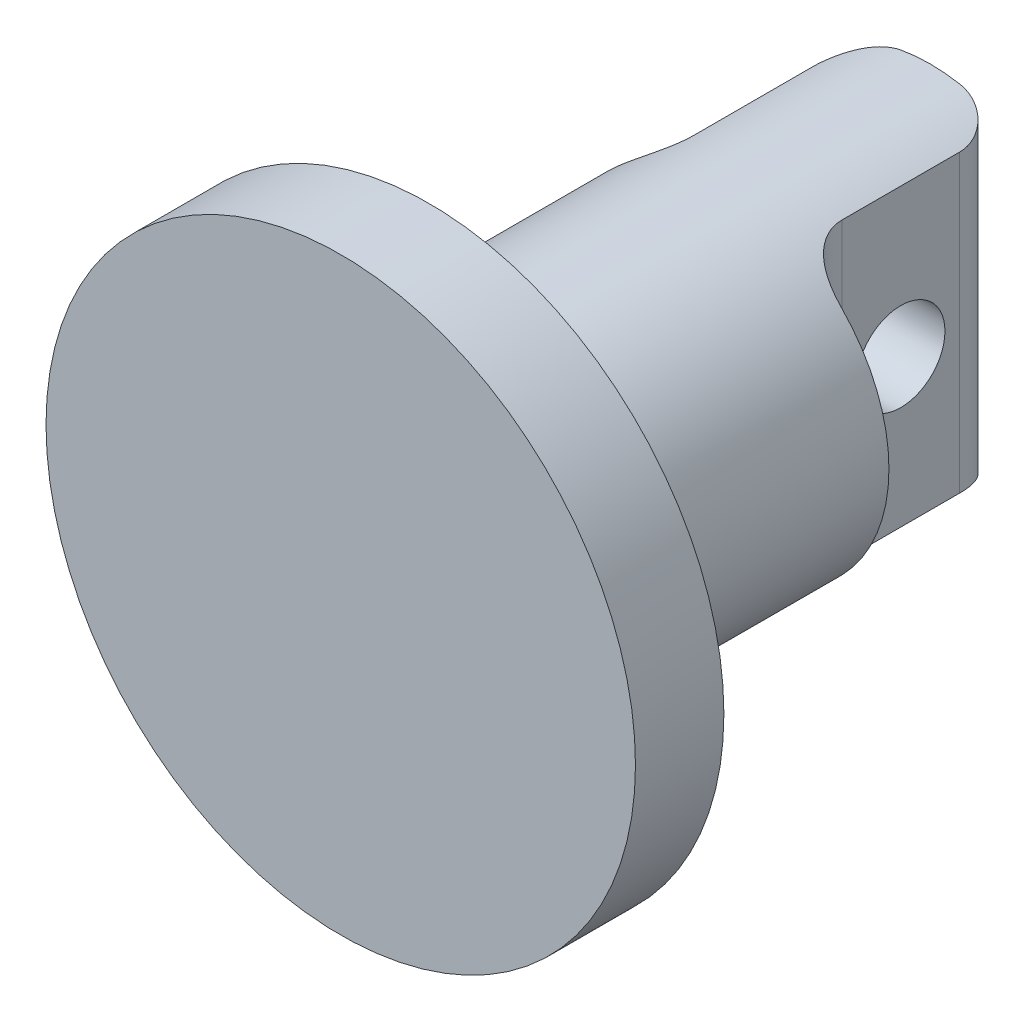
ISO-10303-21;
HEADER;
FILE_DESCRIPTION(('STEP AP214'),'2;1');
FILE_NAME('part.step','',(''),(''),'','','');
FILE_SCHEMA(('AUTOMOTIVE_DESIGN { 1 0 10303 214 1 1 1 1 }'));
ENDSEC;
DATA;
#1=APPLICATION_CONTEXT('core data for automotive mechanical design processes');
#2=APPLICATION_PROTOCOL_DEFINITION('international standard','automotive_design',2000,#1);
#3=PRODUCT_CONTEXT('',#1,'mechanical');
#4=PRODUCT('Part','Part','',(#3));
#5=PRODUCT_RELATED_PRODUCT_CATEGORY('part','',(#4));
#6=PRODUCT_DEFINITION_FORMATION('','',#4);
#7=PRODUCT_DEFINITION_CONTEXT('part definition',#1,'design');
#8=PRODUCT_DEFINITION('design','',#6,#7);
#9=PRODUCT_DEFINITION_SHAPE('','',#8);
#10=(LENGTH_UNIT() NAMED_UNIT(*) SI_UNIT(.MILLI.,.METRE.));
#11=(NAMED_UNIT(*) PLANE_ANGLE_UNIT() SI_UNIT($,.RADIAN.));
#12=(NAMED_UNIT(*) SI_UNIT($,.STERADIAN.) SOLID_ANGLE_UNIT());
#13=UNCERTAINTY_MEASURE_WITH_UNIT(LENGTH_MEASURE(1.E-05),#10,'distance_accuracy_value','');
#14=(GEOMETRIC_REPRESENTATION_CONTEXT(3) GLOBAL_UNCERTAINTY_ASSIGNED_CONTEXT((#13)) GLOBAL_UNIT_ASSIGNED_CONTEXT((#10,
#11,#12)) REPRESENTATION_CONTEXT('',''));
#15=CARTESIAN_POINT('',(0.,0.,0.));
#16=DIRECTION('',(0.,0.,1.));
#17=DIRECTION('',(1.,0.,0.));
#18=AXIS2_PLACEMENT_3D('',#15,#16,#17);
#19=CARTESIAN_POINT('',(0.,0.,0.));
#20=DIRECTION('',(0.,0.,1.));
#21=DIRECTION('',(1.,0.,0.));
#22=AXIS2_PLACEMENT_3D('',#19,#20,#21);
#23=PLANE('',#22);
#24=CARTESIAN_POINT('',(0.,0.,0.));
#25=DIRECTION('',(0.,0.,1.));
#26=DIRECTION('',(1.,0.,0.));
#27=AXIS2_PLACEMENT_3D('',#24,#25,#26);
#28=CIRCLE('',#27,8.6);
#29=CARTESIAN_POINT('',(8.6,0.,0.));
#30=VERTEX_POINT('',#29);
#31=EDGE_CURVE('E110',#30,#30,#28,.T.);
#32=ORIENTED_EDGE('',*,*,#31,.T.);
#33=EDGE_LOOP('',(#32));
#34=FACE_BOUND('',#33,.T.);
#35=CARTESIAN_POINT('',(0.,0.,0.));
#36=DIRECTION('',(0.,0.,1.));
#37=DIRECTION('',(1.,0.,0.));
#38=AXIS2_PLACEMENT_3D('',#35,#36,#37);
#39=CIRCLE('',#38,10.);
#40=CARTESIAN_POINT('',(10.,0.,0.));
#41=VERTEX_POINT('',#40);
#42=EDGE_CURVE('E242',#41,#41,#39,.T.);
#43=ORIENTED_EDGE('',*,*,#42,.F.);
#44=EDGE_LOOP('',(#43));
#45=FACE_BOUND('',#44,.T.);
#46=ADVANCED_FACE('F36',(#34,#45),#23,.F.);
#47=CARTESIAN_POINT('',(0.,0.,3.));
#48=DIRECTION('',(0.,0.,-1.));
#49=DIRECTION('',(-1.,0.,0.));
#50=AXIS2_PLACEMENT_3D('',#47,#48,#49);
#51=CYLINDRICAL_SURFACE('',#50,10.);
#52=CARTESIAN_POINT('',(0.,0.,3.));
#53=DIRECTION('',(0.,0.,1.));
#54=DIRECTION('',(1.,0.,0.));
#55=AXIS2_PLACEMENT_3D('',#52,#53,#54);
#56=CIRCLE('',#55,10.);
#57=CARTESIAN_POINT('',(10.,0.,3.));
#58=VERTEX_POINT('',#57);
#59=EDGE_CURVE('E363',#58,#58,#56,.T.);
#60=ORIENTED_EDGE('',*,*,#59,.F.);
#61=EDGE_LOOP('',(#60));
#62=FACE_BOUND('',#61,.T.);
#63=ORIENTED_EDGE('',*,*,#42,.T.);
#64=EDGE_LOOP('',(#63));
#65=FACE_BOUND('',#64,.T.);
#66=ADVANCED_FACE('F206',(#62,#65),#51,.T.);
#67=CARTESIAN_POINT('',(0.,0.,3.));
#68=DIRECTION('',(0.,0.,1.));
#69=DIRECTION('',(1.,0.,0.));
#70=AXIS2_PLACEMENT_3D('',#67,#68,#69);
#71=PLANE('',#70);
#72=ORIENTED_EDGE('',*,*,#59,.T.);
#73=EDGE_LOOP('',(#72));
#74=FACE_BOUND('',#73,.T.);
#75=ADVANCED_FACE('F155',(#74),#71,.T.);
#76=CARTESIAN_POINT('',(0.,0.,-17.));
#77=DIRECTION('',(0.,0.,1.));
#78=DIRECTION('',(1.,0.,0.));
#79=AXIS2_PLACEMENT_3D('',#76,#77,#78);
#80=CYLINDRICAL_SURFACE('',#79,5.6);
#81=CARTESIAN_POINT('',(0.,0.,-3.));
#82=DIRECTION('',(0.,0.,1.));
#83=DIRECTION('',(1.,0.,0.));
#84=AXIS2_PLACEMENT_3D('',#81,#82,#83);
#85=CIRCLE('',#84,5.6);
#86=CARTESIAN_POINT('',(5.6,0.,-3.));
#87=VERTEX_POINT('',#86);
#88=EDGE_CURVE('E125',#87,#87,#85,.F.);
#89=ORIENTED_EDGE('',*,*,#88,.T.);
#90=EDGE_LOOP('',(#89));
#91=FACE_BOUND('',#90,.T.);
#92=DIRECTION('',(0.,0.,1.));
#93=VECTOR('',#92,1.);
#94=CARTESIAN_POINT('',(-2.5,-5.01098792654702,-17.));
#95=LINE('',#94,#93);
#96=CARTESIAN_POINT('',(-2.5,-5.01098792654702,-11.5));
#97=VERTEX_POINT('',#96);
#98=CARTESIAN_POINT('',(-2.5,-5.01098792654702,-15.5));
#99=VERTEX_POINT('',#98);
#100=EDGE_CURVE('E108',#97,#99,#95,.F.);
#101=ORIENTED_EDGE('',*,*,#100,.T.);
#102=CARTESIAN_POINT('',(-2.5,-5.01098792654702,-15.5));
#103=CARTESIAN_POINT('',(-2.5000020804932,-5.01098386540568,-15.5395725011254));
#104=CARTESIAN_POINT('',(-2.49843294481036,-5.01177002350182,-15.5791239922962));
#105=CARTESIAN_POINT('',(-2.49218861536451,-5.01487928972236,-15.6579048751711));
#106=CARTESIAN_POINT('',(-2.48751464530948,-5.017201792326,-15.6971343876123));
#107=CARTESIAN_POINT('',(-2.46895310911888,-5.02637746679336,-15.8135594581204));
#108=CARTESIAN_POINT('',(-2.45052502289085,-5.03543974754558,-15.88991104718));
#109=CARTESIAN_POINT('',(-2.40237161237888,-5.05858790620674,-16.0379794446277));
#110=CARTESIAN_POINT('',(-2.37265886624782,-5.07266818985616,-16.1097013096591));
#111=CARTESIAN_POINT('',(-2.30298371585328,-5.10467755632712,-16.2471099442359));
#112=CARTESIAN_POINT('',(-2.2630111953227,-5.12261043499499,-16.312790669817));
#113=CARTESIAN_POINT('',(-2.17141281857218,-5.16213023737658,-16.4403776451357));
#114=CARTESIAN_POINT('',(-2.11924950501061,-5.18386787648468,-16.5018504279728));
#115=CARTESIAN_POINT('',(-2.00607340449965,-5.22870677700186,-16.615459784027));
#116=CARTESIAN_POINT('',(-1.94505678929908,-5.25180862573225,-16.667592296518));
#117=CARTESIAN_POINT('',(-1.81019268688118,-5.29987993214784,-16.7653363169122));
#118=CARTESIAN_POINT('',(-1.73570424955865,-5.32484780646086,-16.8100673581615));
#119=CARTESIAN_POINT('',(-1.57974465073416,-5.37317998442629,-16.886151142896));
#120=CARTESIAN_POINT('',(-1.49827861035609,-5.39654544185285,-16.9175135987391));
#121=CARTESIAN_POINT('',(-1.34760565609259,-5.43587189487601,-16.960819199001));
#122=CARTESIAN_POINT('',(-1.27929438996599,-5.45237039149003,-16.9754206613721));
#123=CARTESIAN_POINT('',(-1.14076362477681,-5.48304543588229,-16.9950256519124));
#124=CARTESIAN_POINT('',(-1.07054304586715,-5.49722063643315,-17.0000236291209));
#125=CARTESIAN_POINT('',(-1.,-5.50999092558236,-17.));
#126=B_SPLINE_CURVE_WITH_KNOTS('',3,(#102,#103,#104,#105,#106,#107,#108,#109,#110,#111,#112,
#113,#114,#115,#116,#117,#118,#119,#120,#121,#122,#123,#124,#125),.UNSPECIFIED.,.F.,.F.,(4,2,2,
2,2,2,2,2,2,2,2,4),(0.,0.118637964226897,0.237229197409223,0.473170501747677,0.708849588412844,
0.944761956370707,1.19422423603551,1.44379470880183,1.71375047222331,1.98350977549838,
2.19815830777773,2.41293087289718),.UNSPECIFIED.);
#127=CARTESIAN_POINT('',(-1.,-5.50999092558236,-17.));
#128=VERTEX_POINT('',#127);
#129=EDGE_CURVE('E171',#99,#128,#126,.T.);
#130=ORIENTED_EDGE('',*,*,#129,.T.);
#131=CARTESIAN_POINT('',(0.,0.,-17.));
#132=DIRECTION('',(0.,0.,-1.));
#133=DIRECTION('',(-1.,0.,0.));
#134=AXIS2_PLACEMENT_3D('',#131,#132,#133);
#135=CIRCLE('',#134,5.6);
#136=CARTESIAN_POINT('',(1.,-5.50999092558236,-17.));
#137=VERTEX_POINT('',#136);
#138=EDGE_CURVE('E243',#137,#128,#135,.T.);
#139=ORIENTED_EDGE('',*,*,#138,.F.);
#140=CARTESIAN_POINT('',(1.,-5.50999092558236,-17.));
#141=CARTESIAN_POINT('',(1.0431357750744,-5.50216525904986,-17.0000002889022));
#142=CARTESIAN_POINT('',(1.08615359317973,-5.49383123010131,-16.9981384460265));
#143=CARTESIAN_POINT('',(1.17166685141476,-5.47623015731936,-16.9907624586411));
#144=CARTESIAN_POINT('',(1.21416247296195,-5.46696344841963,-16.9852496212957));
#145=CARTESIAN_POINT('',(1.3401887639641,-5.43794852352108,-16.9633914739219));
#146=CARTESIAN_POINT('',(1.42256390588289,-5.41692970323941,-16.9417254477834));
#147=CARTESIAN_POINT('',(1.58180278663491,-5.37259209995911,-16.8851540203785));
#148=CARTESIAN_POINT('',(1.65867169675423,-5.34927552517556,-16.8502612403694));
#149=CARTESIAN_POINT('',(1.80531751706315,-5.30158259710547,-16.7682756767982));
#150=CARTESIAN_POINT('',(1.87508918255689,-5.2772054788231,-16.7211739610188));
#151=CARTESIAN_POINT('',(2.0083556690194,-5.22797720762672,-16.6139160966464));
#152=CARTESIAN_POINT('',(2.07151596208769,-5.20314268003664,-16.5533357924905));
#153=CARTESIAN_POINT('',(2.18673797636213,-5.15577972730389,-16.4215791801319));
#154=CARTESIAN_POINT('',(2.23879824157279,-5.1332516048946,-16.3504014839417));
#155=CARTESIAN_POINT('',(2.32948785162619,-5.0927330594954,-16.2000525597936));
#156=CARTESIAN_POINT('',(2.36827835891485,-5.07468897321799,-16.1209935103895));
#157=CARTESIAN_POINT('',(2.43160009913251,-5.04465718708589,-15.9563554350108));
#158=CARTESIAN_POINT('',(2.45616029662659,-5.03265719156463,-15.8707900567923));
#159=CARTESIAN_POINT('',(2.48193557874058,-5.01996911315989,-15.7369083960247));
#160=CARTESIAN_POINT('',(2.48869640698838,-5.01661546402954,-15.6898457537173));
#161=CARTESIAN_POINT('',(2.49773104489937,-5.01212031245242,-15.5951999860403));
#162=CARTESIAN_POINT('',(2.50000596090449,-5.01097826456884,-15.5476169919148));
#163=CARTESIAN_POINT('',(2.5,-5.01098792654702,-15.5));
#164=B_SPLINE_CURVE_WITH_KNOTS('',3,(#140,#141,#142,#143,#144,#145,#146,#147,#148,#149,#150,
#151,#152,#153,#154,#155,#156,#157,#158,#159,#160,#161,#162,#163),.UNSPECIFIED.,.F.,.F.,(4,2,2,
2,2,2,2,2,2,2,2,4),(0.,0.131429504807568,0.262811979376038,0.52465896302352,0.786256712976935,
1.04804639414124,1.31967659915426,1.59134241212977,1.85958079849224,2.12727127325902,
2.27002499369472,2.4127435029665),.UNSPECIFIED.);
#165=CARTESIAN_POINT('',(2.5,-5.01098792654702,-15.5));
#166=VERTEX_POINT('',#165);
#167=EDGE_CURVE('E133',#137,#166,#164,.T.);
#168=ORIENTED_EDGE('',*,*,#167,.T.);
#169=DIRECTION('',(0.,0.,1.));
#170=VECTOR('',#169,1.);
#171=CARTESIAN_POINT('',(2.5,-5.01098792654702,-17.));
#172=LINE('',#171,#170);
#173=CARTESIAN_POINT('',(2.5,-5.01098792654702,-11.5));
#174=VERTEX_POINT('',#173);
#175=EDGE_CURVE('E120',#166,#174,#172,.T.);
#176=ORIENTED_EDGE('',*,*,#175,.T.);
#177=CARTESIAN_POINT('',(2.5,-5.01098792654702,-11.5));
#178=CARTESIAN_POINT('',(2.49999844532188,-5.01098605975963,-11.4616087248729));
#179=CARTESIAN_POINT('',(2.50147503292777,-5.01025231108213,-11.4232363931987));
#180=CARTESIAN_POINT('',(2.50735348108305,-5.00731410603619,-11.3467785175572));
#181=CARTESIAN_POINT('',(2.51175493108791,-5.00510985607259,-11.3086929340996));
#182=CARTESIAN_POINT('',(2.52926194656355,-4.99630013425496,-11.1954739584162));
#183=CARTESIAN_POINT('',(2.54667063879383,-4.98749773902104,-11.1211207884798));
#184=CARTESIAN_POINT('',(2.59216946245848,-4.96400076184108,-10.9767905047417));
#185=CARTESIAN_POINT('',(2.62026021251362,-4.94930583864348,-10.9068136446547));
#186=CARTESIAN_POINT('',(2.68583584980902,-4.91402750126924,-10.7730039536221));
#187=CARTESIAN_POINT('',(2.72332327114746,-4.89344249844124,-10.709172786487));
#188=CARTESIAN_POINT('',(2.80690028343339,-4.8459942461289,-10.5878278514886));
#189=CARTESIAN_POINT('',(2.85315683574015,-4.81900603636376,-10.5304785632747));
#190=CARTESIAN_POINT('',(2.95167990030185,-4.75929602991547,-10.4247089164592));
#191=CARTESIAN_POINT('',(3.00394464051544,-4.72657592230139,-10.3762859360669));
#192=CARTESIAN_POINT('',(3.11692455378363,-4.65292232365463,-10.2851460559756));
#193=CARTESIAN_POINT('',(3.1779812305425,-4.61153525982092,-10.2432230603618));
#194=CARTESIAN_POINT('',(3.30259788637749,-4.52312917531629,-10.1700105708581));
#195=CARTESIAN_POINT('',(3.36616437104541,-4.47609477201399,-10.1387510539356));
#196=CARTESIAN_POINT('',(3.47863230154504,-4.38895526792786,-10.0925366978604));
#197=CARTESIAN_POINT('',(3.52745519326802,-4.34983358810063,-10.0754750754575));
#198=CARTESIAN_POINT('',(3.624733043728,-4.26911086138937,-10.0468148597547));
#199=CARTESIAN_POINT('',(3.67318758591487,-4.22750737532109,-10.0352217441161));
#200=CARTESIAN_POINT('',(3.76886997937975,-4.14242568117838,-10.0171181181185));
#201=CARTESIAN_POINT('',(3.8161032057753,-4.09895936269225,-10.0105793259212));
#202=CARTESIAN_POINT('',(3.90916509774067,-4.01030876341671,-10.0020267392921));
#203=CARTESIAN_POINT('',(3.95499655700509,-3.96512836484636,-10.0000032754364));
#204=CARTESIAN_POINT('',(4.,-3.91918358845308,-10.));
#205=B_SPLINE_CURVE_WITH_KNOTS('',3,(#177,#178,#179,#180,#181,#182,#183,#184,#185,#186,#187,
#188,#189,#190,#191,#192,#193,#194,#195,#196,#197,#198,#199,#200,#201,#202,#203,#204),
.UNSPECIFIED.,.F.,.F.,(4,2,2,2,2,2,2,2,2,2,2,2,2,4),(0.,0.115101046934982,0.230185941272075,
0.459593197899069,0.689013742013861,0.918496223045589,1.15289102850619,1.38721687860825,
1.64076447615015,1.89501907870281,2.089284445406,2.28374399162558,2.47710738617681,
2.6700563005188),.UNSPECIFIED.);
#206=CARTESIAN_POINT('',(4.,-3.91918358845308,-10.));
#207=VERTEX_POINT('',#206);
#208=EDGE_CURVE('E12',#174,#207,#205,.T.);
#209=ORIENTED_EDGE('',*,*,#208,.T.);
#210=CARTESIAN_POINT('',(0.,0.,-10.));
#211=DIRECTION('',(0.,0.,-1.));
#212=DIRECTION('',(-1.,0.,0.));
#213=AXIS2_PLACEMENT_3D('',#210,#211,#212);
#214=CIRCLE('',#213,5.6);
#215=CARTESIAN_POINT('',(4.,3.91918358845308,-10.));
#216=VERTEX_POINT('',#215);
#217=EDGE_CURVE('E123',#216,#207,#214,.T.);
#218=ORIENTED_EDGE('',*,*,#217,.F.);
#219=CARTESIAN_POINT('',(4.,3.91918358845308,-10.));
#220=CARTESIAN_POINT('',(3.9557336803865,3.96437492473145,-10.0000033469822));
#221=CARTESIAN_POINT('',(3.91066820298925,4.00882603571216,-10.001960904263));
#222=CARTESIAN_POINT('',(3.81918676707573,4.09607014262874,-10.0102269052185));
#223=CARTESIAN_POINT('',(3.77276836887405,4.1388597710828,-10.0165437429517));
#224=CARTESIAN_POINT('',(3.67865738367702,4.22273424589004,-10.0340382842501));
#225=CARTESIAN_POINT('',(3.63095793272987,4.26380422561554,-10.0452514247408));
#226=CARTESIAN_POINT('',(3.53517126489213,4.34355264612186,-10.0729679651696));
#227=CARTESIAN_POINT('',(3.48708440180229,4.38223303908223,-10.0894669767605));
#228=CARTESIAN_POINT('',(3.36770023341093,4.47512441155301,-10.1376084788785));
#229=CARTESIAN_POINT('',(3.29649458651223,4.52773396683386,-10.1727131624566));
#230=CARTESIAN_POINT('',(3.15741936012218,4.62578965948223,-10.2563691011738));
#231=CARTESIAN_POINT('',(3.08954041268094,4.67125681502645,-10.3048796978459));
#232=CARTESIAN_POINT('',(2.95967539347949,4.75461124064817,-10.4159885788762));
#233=CARTESIAN_POINT('',(2.89774353973631,4.7924317165616,-10.4787016416199));
#234=CARTESIAN_POINT('',(2.7841641032247,4.85930002163556,-10.6169749042305));
#235=CARTESIAN_POINT('',(2.73251858454951,4.88834609069483,-10.6925376769387));
#236=CARTESIAN_POINT('',(2.64857801238486,4.9342724729647,-10.844085980049));
#237=CARTESIAN_POINT('',(2.6146816186877,4.95221168523887,-10.918868913277));
#238=CARTESIAN_POINT('',(2.55937136974278,4.98102422435756,-11.074143720394));
#239=CARTESIAN_POINT('',(2.5379390462439,4.99190800812404,-11.1546269485125));
#240=CARTESIAN_POINT('',(2.51557298798128,5.00319512688941,-11.2799333289134));
#241=CARTESIAN_POINT('',(2.5097391768057,5.00612014491925,-11.3237216604271));
#242=CARTESIAN_POINT('',(2.50195365053542,5.01001359195367,-11.4116649506208));
#243=CARTESIAN_POINT('',(2.49999639781366,5.01098481197141,-11.4558192957153));
#244=CARTESIAN_POINT('',(2.5,5.01098792654702,-11.5));
#245=B_SPLINE_CURVE_WITH_KNOTS('',3,(#219,#220,#221,#222,#223,#224,#225,#226,#227,#228,#229,
#230,#231,#232,#233,#234,#235,#236,#237,#238,#239,#240,#241,#242,#243,#244),.UNSPECIFIED.,.F.,
.F.,(4,2,2,2,2,2,2,2,2,2,2,2,4),(0.,0.189784007279751,0.379934478566911,0.571484582290015,
0.762876070802288,1.04739762955487,1.33106556508882,1.61711342007846,1.90321861676455,
2.15402154935302,2.40445190932844,2.53707794764393,2.66951439388349),.UNSPECIFIED.);
#246=CARTESIAN_POINT('',(2.5,5.01098792654702,-11.5));
#247=VERTEX_POINT('',#246);
#248=EDGE_CURVE('E49',#216,#247,#245,.T.);
#249=ORIENTED_EDGE('',*,*,#248,.T.);
#250=DIRECTION('',(0.,0.,1.));
#251=VECTOR('',#250,1.);
#252=CARTESIAN_POINT('',(2.5,5.01098792654702,-17.));
#253=LINE('',#252,#251);
#254=CARTESIAN_POINT('',(2.5,5.01098792654702,-15.5));
#255=VERTEX_POINT('',#254);
#256=EDGE_CURVE('E235',#247,#255,#253,.F.);
#257=ORIENTED_EDGE('',*,*,#256,.T.);
#258=CARTESIAN_POINT('',(2.5,5.01098792654702,-15.5));
#259=CARTESIAN_POINT('',(2.5000020804932,5.01098386540568,-15.5395725011254));
#260=CARTESIAN_POINT('',(2.49843294481036,5.01177002350182,-15.5791239922962));
#261=CARTESIAN_POINT('',(2.49218861536451,5.01487928972236,-15.6579048751711));
#262=CARTESIAN_POINT('',(2.48751464530948,5.017201792326,-15.6971343876123));
#263=CARTESIAN_POINT('',(2.46895310911888,5.02637746679336,-15.8135594581204));
#264=CARTESIAN_POINT('',(2.45052502289085,5.03543974754558,-15.88991104718));
#265=CARTESIAN_POINT('',(2.40237161237888,5.05858790620674,-16.0379794446277));
#266=CARTESIAN_POINT('',(2.37265886624782,5.07266818985616,-16.1097013096591));
#267=CARTESIAN_POINT('',(2.30298371585328,5.10467755632712,-16.2471099442359));
#268=CARTESIAN_POINT('',(2.2630111953227,5.12261043499499,-16.312790669817));
#269=CARTESIAN_POINT('',(2.17141281857218,5.16213023737658,-16.4403776451357));
#270=CARTESIAN_POINT('',(2.11924950501061,5.18386787648468,-16.5018504279728));
#271=CARTESIAN_POINT('',(2.00607340449965,5.22870677700186,-16.615459784027));
#272=CARTESIAN_POINT('',(1.94505678929908,5.25180862573225,-16.667592296518));
#273=CARTESIAN_POINT('',(1.81019268688118,5.29987993214784,-16.7653363169122));
#274=CARTESIAN_POINT('',(1.73570424955865,5.32484780646086,-16.8100673581615));
#275=CARTESIAN_POINT('',(1.57974465073416,5.37317998442629,-16.886151142896));
#276=CARTESIAN_POINT('',(1.49827861035609,5.39654544185285,-16.9175135987391));
#277=CARTESIAN_POINT('',(1.34760565609259,5.43587189487601,-16.960819199001));
#278=CARTESIAN_POINT('',(1.27929438996599,5.45237039149003,-16.9754206613721));
#279=CARTESIAN_POINT('',(1.14076362477681,5.48304543588229,-16.9950256519124));
#280=CARTESIAN_POINT('',(1.07054304586715,5.49722063643315,-17.0000236291209));
#281=CARTESIAN_POINT('',(1.,5.50999092558236,-17.));
#282=B_SPLINE_CURVE_WITH_KNOTS('',3,(#258,#259,#260,#261,#262,#263,#264,#265,#266,#267,#268,
#269,#270,#271,#272,#273,#274,#275,#276,#277,#278,#279,#280,#281),.UNSPECIFIED.,.F.,.F.,(4,2,2,
2,2,2,2,2,2,2,2,4),(0.,0.118637964226897,0.237229197409223,0.473170501747677,0.708849588412844,
0.944761956370707,1.19422423603551,1.44379470880183,1.71375047222331,1.98350977549838,
2.19815830777773,2.41293087289718),.UNSPECIFIED.);
#283=CARTESIAN_POINT('',(1.,5.50999092558236,-17.));
#284=VERTEX_POINT('',#283);
#285=EDGE_CURVE('E140',#255,#284,#282,.T.);
#286=ORIENTED_EDGE('',*,*,#285,.T.);
#287=CARTESIAN_POINT('',(-1.,5.50999092558236,-17.));
#288=VERTEX_POINT('',#287);
#289=EDGE_CURVE('E233',#288,#284,#135,.T.);
#290=ORIENTED_EDGE('',*,*,#289,.F.);
#291=CARTESIAN_POINT('',(-1.,5.50999092558236,-17.));
#292=CARTESIAN_POINT('',(-1.0431357750744,5.50216525904986,-17.0000002889022));
#293=CARTESIAN_POINT('',(-1.08615359317973,5.49383123010131,-16.9981384460265));
#294=CARTESIAN_POINT('',(-1.17166685141476,5.47623015731936,-16.9907624586411));
#295=CARTESIAN_POINT('',(-1.21416247296195,5.46696344841963,-16.9852496212957));
#296=CARTESIAN_POINT('',(-1.3401887639641,5.43794852352108,-16.9633914739219));
#297=CARTESIAN_POINT('',(-1.42256390588289,5.41692970323941,-16.9417254477834));
#298=CARTESIAN_POINT('',(-1.58180278663491,5.37259209995911,-16.8851540203785));
#299=CARTESIAN_POINT('',(-1.65867169675423,5.34927552517556,-16.8502612403694));
#300=CARTESIAN_POINT('',(-1.80531751706315,5.30158259710547,-16.7682756767982));
#301=CARTESIAN_POINT('',(-1.87508918255689,5.2772054788231,-16.7211739610188));
#302=CARTESIAN_POINT('',(-2.0083556690194,5.22797720762672,-16.6139160966464));
#303=CARTESIAN_POINT('',(-2.07151596208769,5.20314268003664,-16.5533357924905));
#304=CARTESIAN_POINT('',(-2.18673797636213,5.15577972730389,-16.4215791801319));
#305=CARTESIAN_POINT('',(-2.23879824157279,5.1332516048946,-16.3504014839417));
#306=CARTESIAN_POINT('',(-2.32948785162619,5.0927330594954,-16.2000525597936));
#307=CARTESIAN_POINT('',(-2.36827835891485,5.07468897321799,-16.1209935103895));
#308=CARTESIAN_POINT('',(-2.43160009913251,5.04465718708589,-15.9563554350108));
#309=CARTESIAN_POINT('',(-2.45616029662659,5.03265719156463,-15.8707900567923));
#310=CARTESIAN_POINT('',(-2.48193557874058,5.01996911315989,-15.7369083960247));
#311=CARTESIAN_POINT('',(-2.48869640698838,5.01661546402954,-15.6898457537173));
#312=CARTESIAN_POINT('',(-2.49773104489937,5.01212031245242,-15.5951999860403));
#313=CARTESIAN_POINT('',(-2.50000596090449,5.01097826456884,-15.5476169919148));
#314=CARTESIAN_POINT('',(-2.5,5.01098792654702,-15.5));
#315=B_SPLINE_CURVE_WITH_KNOTS('',3,(#291,#292,#293,#294,#295,#296,#297,#298,#299,#300,#301,
#302,#303,#304,#305,#306,#307,#308,#309,#310,#311,#312,#313,#314),.UNSPECIFIED.,.F.,.F.,(4,2,2,
2,2,2,2,2,2,2,2,4),(0.,0.131429504807568,0.262811979376038,0.52465896302352,0.786256712976935,
1.04804639414124,1.31967659915426,1.59134241212977,1.85958079849224,2.12727127325902,
2.27002499369472,2.4127435029665),.UNSPECIFIED.);
#316=CARTESIAN_POINT('',(-2.5,5.01098792654702,-15.5));
#317=VERTEX_POINT('',#316);
#318=EDGE_CURVE('E164',#288,#317,#315,.T.);
#319=ORIENTED_EDGE('',*,*,#318,.T.);
#320=DIRECTION('',(0.,0.,1.));
#321=VECTOR('',#320,1.);
#322=CARTESIAN_POINT('',(-2.5,5.01098792654702,-17.));
#323=LINE('',#322,#321);
#324=CARTESIAN_POINT('',(-2.5,5.01098792654702,-11.5));
#325=VERTEX_POINT('',#324);
#326=EDGE_CURVE('E119',#317,#325,#323,.T.);
#327=ORIENTED_EDGE('',*,*,#326,.T.);
#328=CARTESIAN_POINT('',(-2.5,5.01098792654702,-11.5));
#329=CARTESIAN_POINT('',(-2.49999844532188,5.01098605975963,-11.4616087248729));
#330=CARTESIAN_POINT('',(-2.50147503292777,5.01025231108213,-11.4232363931987));
#331=CARTESIAN_POINT('',(-2.50735348108305,5.00731410603619,-11.3467785175572));
#332=CARTESIAN_POINT('',(-2.51175493108791,5.00510985607259,-11.3086929340996));
#333=CARTESIAN_POINT('',(-2.52926194656355,4.99630013425496,-11.1954739584162));
#334=CARTESIAN_POINT('',(-2.54667063879383,4.98749773902104,-11.1211207884798));
#335=CARTESIAN_POINT('',(-2.59216946245848,4.96400076184108,-10.9767905047417));
#336=CARTESIAN_POINT('',(-2.62026021251362,4.94930583864348,-10.9068136446547));
#337=CARTESIAN_POINT('',(-2.68583584980902,4.91402750126924,-10.7730039536221));
#338=CARTESIAN_POINT('',(-2.72332327114746,4.89344249844124,-10.709172786487));
#339=CARTESIAN_POINT('',(-2.80690028343339,4.8459942461289,-10.5878278514886));
#340=CARTESIAN_POINT('',(-2.85315683574015,4.81900603636376,-10.5304785632747));
#341=CARTESIAN_POINT('',(-2.95167990030185,4.75929602991547,-10.4247089164592));
#342=CARTESIAN_POINT('',(-3.00394464051544,4.72657592230139,-10.3762859360669));
#343=CARTESIAN_POINT('',(-3.11692455378363,4.65292232365463,-10.2851460559756));
#344=CARTESIAN_POINT('',(-3.1779812305425,4.61153525982092,-10.2432230603618));
#345=CARTESIAN_POINT('',(-3.30259788637749,4.52312917531629,-10.1700105708581));
#346=CARTESIAN_POINT('',(-3.36616437104541,4.47609477201399,-10.1387510539356));
#347=CARTESIAN_POINT('',(-3.47863230154504,4.38895526792786,-10.0925366978604));
#348=CARTESIAN_POINT('',(-3.52745519326802,4.34983358810063,-10.0754750754575));
#349=CARTESIAN_POINT('',(-3.624733043728,4.26911086138937,-10.0468148597547));
#350=CARTESIAN_POINT('',(-3.67318758591487,4.22750737532109,-10.0352217441161));
#351=CARTESIAN_POINT('',(-3.76886997937975,4.14242568117838,-10.0171181181185));
#352=CARTESIAN_POINT('',(-3.8161032057753,4.09895936269225,-10.0105793259212));
#353=CARTESIAN_POINT('',(-3.90916509774067,4.01030876341671,-10.0020267392921));
#354=CARTESIAN_POINT('',(-3.95499655700509,3.96512836484636,-10.0000032754364));
#355=CARTESIAN_POINT('',(-4.,3.91918358845308,-10.));
#356=B_SPLINE_CURVE_WITH_KNOTS('',3,(#328,#329,#330,#331,#332,#333,#334,#335,#336,#337,#338,
#339,#340,#341,#342,#343,#344,#345,#346,#347,#348,#349,#350,#351,#352,#353,#354,#355),
.UNSPECIFIED.,.F.,.F.,(4,2,2,2,2,2,2,2,2,2,2,2,2,4),(0.,0.115101046934982,0.230185941272075,
0.459593197899069,0.689013742013861,0.918496223045589,1.15289102850619,1.38721687860825,
1.64076447615015,1.89501907870281,2.089284445406,2.28374399162558,2.47710738617681,
2.6700563005188),.UNSPECIFIED.);
#357=CARTESIAN_POINT('',(-4.,3.91918358845308,-10.));
#358=VERTEX_POINT('',#357);
#359=EDGE_CURVE('E64',#325,#358,#356,.T.);
#360=ORIENTED_EDGE('',*,*,#359,.T.);
#361=CARTESIAN_POINT('',(0.,0.,-10.));
#362=DIRECTION('',(0.,0.,1.));
#363=DIRECTION('',(1.,0.,0.));
#364=AXIS2_PLACEMENT_3D('',#361,#362,#363);
#365=CIRCLE('',#364,5.6);
#366=CARTESIAN_POINT('',(-4.,-3.91918358845308,-10.));
#367=VERTEX_POINT('',#366);
#368=EDGE_CURVE('E109',#358,#367,#365,.T.);
#369=ORIENTED_EDGE('',*,*,#368,.T.);
#370=CARTESIAN_POINT('',(-4.,-3.91918358845308,-10.));
#371=CARTESIAN_POINT('',(-3.9557336803865,-3.96437492473145,-10.0000033469822));
#372=CARTESIAN_POINT('',(-3.91066820298925,-4.00882603571216,-10.001960904263));
#373=CARTESIAN_POINT('',(-3.81918676707573,-4.09607014262874,-10.0102269052185));
#374=CARTESIAN_POINT('',(-3.77276836887405,-4.1388597710828,-10.0165437429517));
#375=CARTESIAN_POINT('',(-3.67865738367702,-4.22273424589004,-10.0340382842501));
#376=CARTESIAN_POINT('',(-3.63095793272987,-4.26380422561554,-10.0452514247408));
#377=CARTESIAN_POINT('',(-3.53517126489213,-4.34355264612186,-10.0729679651696));
#378=CARTESIAN_POINT('',(-3.48708440180229,-4.38223303908223,-10.0894669767605));
#379=CARTESIAN_POINT('',(-3.36770023341093,-4.47512441155301,-10.1376084788785));
#380=CARTESIAN_POINT('',(-3.29649458651223,-4.52773396683386,-10.1727131624566));
#381=CARTESIAN_POINT('',(-3.15741936012218,-4.62578965948223,-10.2563691011738));
#382=CARTESIAN_POINT('',(-3.08954041268094,-4.67125681502645,-10.3048796978459));
#383=CARTESIAN_POINT('',(-2.95967539347949,-4.75461124064817,-10.4159885788762));
#384=CARTESIAN_POINT('',(-2.89774353973631,-4.7924317165616,-10.4787016416199));
#385=CARTESIAN_POINT('',(-2.7841641032247,-4.85930002163556,-10.6169749042305));
#386=CARTESIAN_POINT('',(-2.73251858454951,-4.88834609069483,-10.6925376769387));
#387=CARTESIAN_POINT('',(-2.64857801238486,-4.9342724729647,-10.844085980049));
#388=CARTESIAN_POINT('',(-2.6146816186877,-4.95221168523887,-10.918868913277));
#389=CARTESIAN_POINT('',(-2.55937136974278,-4.98102422435756,-11.074143720394));
#390=CARTESIAN_POINT('',(-2.5379390462439,-4.99190800812404,-11.1546269485125));
#391=CARTESIAN_POINT('',(-2.51557298798128,-5.00319512688941,-11.2799333289134));
#392=CARTESIAN_POINT('',(-2.5097391768057,-5.00612014491925,-11.3237216604271));
#393=CARTESIAN_POINT('',(-2.50195365053542,-5.01001359195367,-11.4116649506208));
#394=CARTESIAN_POINT('',(-2.49999639781366,-5.01098481197141,-11.4558192957153));
#395=CARTESIAN_POINT('',(-2.5,-5.01098792654702,-11.5));
#396=B_SPLINE_CURVE_WITH_KNOTS('',3,(#370,#371,#372,#373,#374,#375,#376,#377,#378,#379,#380,
#381,#382,#383,#384,#385,#386,#387,#388,#389,#390,#391,#392,#393,#394,#395),.UNSPECIFIED.,.F.,
.F.,(4,2,2,2,2,2,2,2,2,2,2,2,4),(0.,0.189784007279751,0.379934478566911,0.571484582290015,
0.762876070802288,1.04739762955487,1.33106556508882,1.61711342007846,1.90321861676455,
2.15402154935302,2.40445190932844,2.53707794764393,2.66951439388349),.UNSPECIFIED.);
#397=EDGE_CURVE('E56',#367,#97,#396,.T.);
#398=ORIENTED_EDGE('',*,*,#397,.T.);
#399=EDGE_LOOP('',(#101,#130,#139,#168,#176,#209,#218,#249,#257,#286,#290,#319,#327,#360,#369,#398));
#400=FACE_BOUND('',#399,.T.);
#401=ADVANCED_FACE('F107',(#91,#400),#80,.T.);
#402=CARTESIAN_POINT('',(0.,0.,-17.));
#403=DIRECTION('',(0.,0.,-1.));
#404=DIRECTION('',(-1.,0.,0.));
#405=AXIS2_PLACEMENT_3D('',#402,#403,#404);
#406=PLANE('',#405);
#407=ORIENTED_EDGE('',*,*,#138,.T.);
#408=DIRECTION('',(0.,-1.,0.));
#409=VECTOR('',#408,1.);
#410=CARTESIAN_POINT('',(-1.,5.01098792654702,-17.));
#411=LINE('',#410,#409);
#412=EDGE_CURVE('E228',#128,#288,#411,.F.);
#413=ORIENTED_EDGE('',*,*,#412,.T.);
#414=ORIENTED_EDGE('',*,*,#289,.T.);
#415=DIRECTION('',(0.,1.,0.));
#416=VECTOR('',#415,1.);
#417=CARTESIAN_POINT('',(1.,-5.01098792654702,-17.));
#418=LINE('',#417,#416);
#419=EDGE_CURVE('E230',#284,#137,#418,.F.);
#420=ORIENTED_EDGE('',*,*,#419,.T.);
#421=EDGE_LOOP('',(#407,#413,#414,#420));
#422=FACE_BOUND('',#421,.T.);
#423=ADVANCED_FACE('F154',(#422),#406,.T.);
#424=CARTESIAN_POINT('',(-0.625761910770769,-0.537352555701064,-10.));
#425=DIRECTION('',(0.,0.,1.));
#426=DIRECTION('',(1.,0.,0.));
#427=AXIS2_PLACEMENT_3D('',#424,#425,#426);
#428=PLANE('',#427);
#429=ORIENTED_EDGE('',*,*,#368,.F.);
#430=DIRECTION('',(0.,-1.,0.));
#431=VECTOR('',#430,1.);
#432=CARTESIAN_POINT('',(-4.,-5.01098792654702,-10.));
#433=LINE('',#432,#431);
#434=EDGE_CURVE('E252',#358,#367,#433,.T.);
#435=ORIENTED_EDGE('',*,*,#434,.T.);
#436=EDGE_LOOP('',(#429,#435));
#437=FACE_BOUND('',#436,.T.);
#438=ADVANCED_FACE('F311',(#437),#428,.F.);
#439=CARTESIAN_POINT('',(-2.5,0.,-10.));
#440=DIRECTION('',(1.,0.,0.));
#441=DIRECTION('',(0.,0.,-1.));
#442=AXIS2_PLACEMENT_3D('',#439,#440,#441);
#443=PLANE('',#442);
#444=CARTESIAN_POINT('',(-2.5,0.,-13.5));
#445=DIRECTION('',(1.,0.,0.));
#446=DIRECTION('',(0.,0.,-1.));
#447=AXIS2_PLACEMENT_3D('',#444,#445,#446);
#448=CIRCLE('',#447,1.5);
#449=CARTESIAN_POINT('',(-2.5,0.,-15.));
#450=VERTEX_POINT('',#449);
#451=EDGE_CURVE('E372',#450,#450,#448,.F.);
#452=ORIENTED_EDGE('',*,*,#451,.F.);
#453=EDGE_LOOP('',(#452));
#454=FACE_BOUND('',#453,.T.);
#455=ORIENTED_EDGE('',*,*,#326,.F.);
#456=DIRECTION('',(0.,-1.,0.));
#457=VECTOR('',#456,1.);
#458=CARTESIAN_POINT('',(-2.5,-5.01098792654702,-15.5));
#459=LINE('',#458,#457);
#460=EDGE_CURVE('E118',#317,#99,#459,.T.);
#461=ORIENTED_EDGE('',*,*,#460,.T.);
#462=ORIENTED_EDGE('',*,*,#100,.F.);
#463=DIRECTION('',(0.,-1.,0.));
#464=VECTOR('',#463,1.);
#465=CARTESIAN_POINT('',(-2.5,5.01098792654702,-11.5));
#466=LINE('',#465,#464);
#467=EDGE_CURVE('E116',#97,#325,#466,.F.);
#468=ORIENTED_EDGE('',*,*,#467,.T.);
#469=EDGE_LOOP('',(#455,#461,#462,#468));
#470=FACE_BOUND('',#469,.T.);
#471=ADVANCED_FACE('F115',(#454,#470),#443,.F.);
#472=CARTESIAN_POINT('',(0.0680037698119621,-0.537352555701064,-10.));
#473=DIRECTION('',(0.,0.,-1.));
#474=DIRECTION('',(-1.,0.,0.));
#475=AXIS2_PLACEMENT_3D('',#472,#473,#474);
#476=PLANE('',#475);
#477=ORIENTED_EDGE('',*,*,#217,.T.);
#478=DIRECTION('',(0.,1.,0.));
#479=VECTOR('',#478,1.);
#480=CARTESIAN_POINT('',(4.,-0.537352555701064,-10.));
#481=LINE('',#480,#479);
#482=EDGE_CURVE('E254',#207,#216,#481,.T.);
#483=ORIENTED_EDGE('',*,*,#482,.T.);
#484=EDGE_LOOP('',(#477,#483));
#485=FACE_BOUND('',#484,.T.);
#486=ADVANCED_FACE('F291',(#485),#476,.T.);
#487=CARTESIAN_POINT('',(2.5,0.,-10.));
#488=DIRECTION('',(-1.,0.,0.));
#489=DIRECTION('',(0.,0.,1.));
#490=AXIS2_PLACEMENT_3D('',#487,#488,#489);
#491=PLANE('',#490);
#492=CARTESIAN_POINT('',(2.5,0.,-13.5));
#493=DIRECTION('',(1.,0.,0.));
#494=DIRECTION('',(0.,0.,-1.));
#495=AXIS2_PLACEMENT_3D('',#492,#493,#494);
#496=CIRCLE('',#495,1.5);
#497=CARTESIAN_POINT('',(2.5,0.,-15.));
#498=VERTEX_POINT('',#497);
#499=EDGE_CURVE('E375',#498,#498,#496,.T.);
#500=ORIENTED_EDGE('',*,*,#499,.F.);
#501=EDGE_LOOP('',(#500));
#502=FACE_BOUND('',#501,.T.);
#503=ORIENTED_EDGE('',*,*,#175,.F.);
#504=DIRECTION('',(0.,1.,0.));
#505=VECTOR('',#504,1.);
#506=CARTESIAN_POINT('',(2.5,5.01098792654702,-15.5));
#507=LINE('',#506,#505);
#508=EDGE_CURVE('E250',#166,#255,#507,.T.);
#509=ORIENTED_EDGE('',*,*,#508,.T.);
#510=ORIENTED_EDGE('',*,*,#256,.F.);
#511=DIRECTION('',(0.,1.,0.));
#512=VECTOR('',#511,1.);
#513=CARTESIAN_POINT('',(2.5,0.,-11.5));
#514=LINE('',#513,#512);
#515=EDGE_CURVE('E246',#247,#174,#514,.F.);
#516=ORIENTED_EDGE('',*,*,#515,.T.);
#517=EDGE_LOOP('',(#503,#509,#510,#516));
#518=FACE_BOUND('',#517,.T.);
#519=ADVANCED_FACE('F223',(#502,#518),#491,.F.);
#520=CARTESIAN_POINT('',(-10.001,0.,-13.5));
#521=DIRECTION('',(1.,0.,0.));
#522=DIRECTION('',(0.,0.,-1.));
#523=AXIS2_PLACEMENT_3D('',#520,#521,#522);
#524=CYLINDRICAL_SURFACE('',#523,1.5);
#525=ORIENTED_EDGE('',*,*,#499,.T.);
#526=EDGE_LOOP('',(#525));
#527=FACE_BOUND('',#526,.T.);
#528=ORIENTED_EDGE('',*,*,#451,.T.);
#529=EDGE_LOOP('',(#528));
#530=FACE_BOUND('',#529,.T.);
#531=ADVANCED_FACE('F217',(#527,#530),#524,.F.);
#532=CARTESIAN_POINT('',(-1.,0.,-15.5));
#533=DIRECTION('',(0.,1.,0.));
#534=DIRECTION('',(0.,0.,1.));
#535=AXIS2_PLACEMENT_3D('',#532,#533,#534);
#536=CYLINDRICAL_SURFACE('',#535,1.5);
#537=ORIENTED_EDGE('',*,*,#318,.F.);
#538=ORIENTED_EDGE('',*,*,#412,.F.);
#539=ORIENTED_EDGE('',*,*,#129,.F.);
#540=ORIENTED_EDGE('',*,*,#460,.F.);
#541=EDGE_LOOP('',(#537,#538,#539,#540));
#542=FACE_BOUND('',#541,.T.);
#543=ADVANCED_FACE('F203',(#542),#536,.T.);
#544=CARTESIAN_POINT('',(1.,0.,-15.5));
#545=DIRECTION('',(0.,-1.,0.));
#546=DIRECTION('',(0.,0.,-1.));
#547=AXIS2_PLACEMENT_3D('',#544,#545,#546);
#548=CYLINDRICAL_SURFACE('',#547,1.5);
#549=ORIENTED_EDGE('',*,*,#167,.F.);
#550=ORIENTED_EDGE('',*,*,#419,.F.);
#551=ORIENTED_EDGE('',*,*,#285,.F.);
#552=ORIENTED_EDGE('',*,*,#508,.F.);
#553=EDGE_LOOP('',(#549,#550,#551,#552));
#554=FACE_BOUND('',#553,.T.);
#555=ADVANCED_FACE('F146',(#554),#548,.T.);
#556=CARTESIAN_POINT('',(-4.,-0.537352555701064,-11.5));
#557=DIRECTION('',(0.,1.,0.));
#558=DIRECTION('',(0.,0.,1.));
#559=AXIS2_PLACEMENT_3D('',#556,#557,#558);
#560=CYLINDRICAL_SURFACE('',#559,1.5);
#561=ORIENTED_EDGE('',*,*,#359,.F.);
#562=ORIENTED_EDGE('',*,*,#467,.F.);
#563=ORIENTED_EDGE('',*,*,#397,.F.);
#564=ORIENTED_EDGE('',*,*,#434,.F.);
#565=EDGE_LOOP('',(#561,#562,#563,#564));
#566=FACE_BOUND('',#565,.T.);
#567=ADVANCED_FACE('F122',(#566),#560,.F.);
#568=CARTESIAN_POINT('',(4.,-0.537352555701064,-11.5));
#569=DIRECTION('',(0.,1.,0.));
#570=DIRECTION('',(0.,0.,1.));
#571=AXIS2_PLACEMENT_3D('',#568,#569,#570);
#572=CYLINDRICAL_SURFACE('',#571,1.5);
#573=ORIENTED_EDGE('',*,*,#208,.F.);
#574=ORIENTED_EDGE('',*,*,#515,.F.);
#575=ORIENTED_EDGE('',*,*,#248,.F.);
#576=ORIENTED_EDGE('',*,*,#482,.F.);
#577=EDGE_LOOP('',(#573,#574,#575,#576));
#578=FACE_BOUND('',#577,.T.);
#579=ADVANCED_FACE('F192',(#578),#572,.F.);
#580=CARTESIAN_POINT('',(0.,0.,-3.));
#581=DIRECTION('',(0.,0.,1.));
#582=DIRECTION('',(1.,0.,0.));
#583=AXIS2_PLACEMENT_3D('',#580,#581,#582);
#584=TOROIDAL_SURFACE('',#583,8.6,3.);
#585=ORIENTED_EDGE('',*,*,#31,.F.);
#586=EDGE_LOOP('',(#585));
#587=FACE_BOUND('',#586,.T.);
#588=ORIENTED_EDGE('',*,*,#88,.F.);
#589=EDGE_LOOP('',(#588));
#590=FACE_BOUND('',#589,.T.);
#591=ADVANCED_FACE('F38',(#587,#590),#584,.F.);
#592=CLOSED_SHELL('',(#46,#66,#75,#401,#423,#438,#471,#486,#519,#531,#543,#555,#567,#579,#591));
#593=MANIFOLD_SOLID_BREP('B2',#592);
#594=ADVANCED_BREP_SHAPE_REPRESENTATION('',(#18,#593),#14);
#595=SHAPE_DEFINITION_REPRESENTATION(#9,#594);
ENDSEC;
END-ISO-10303-21;
